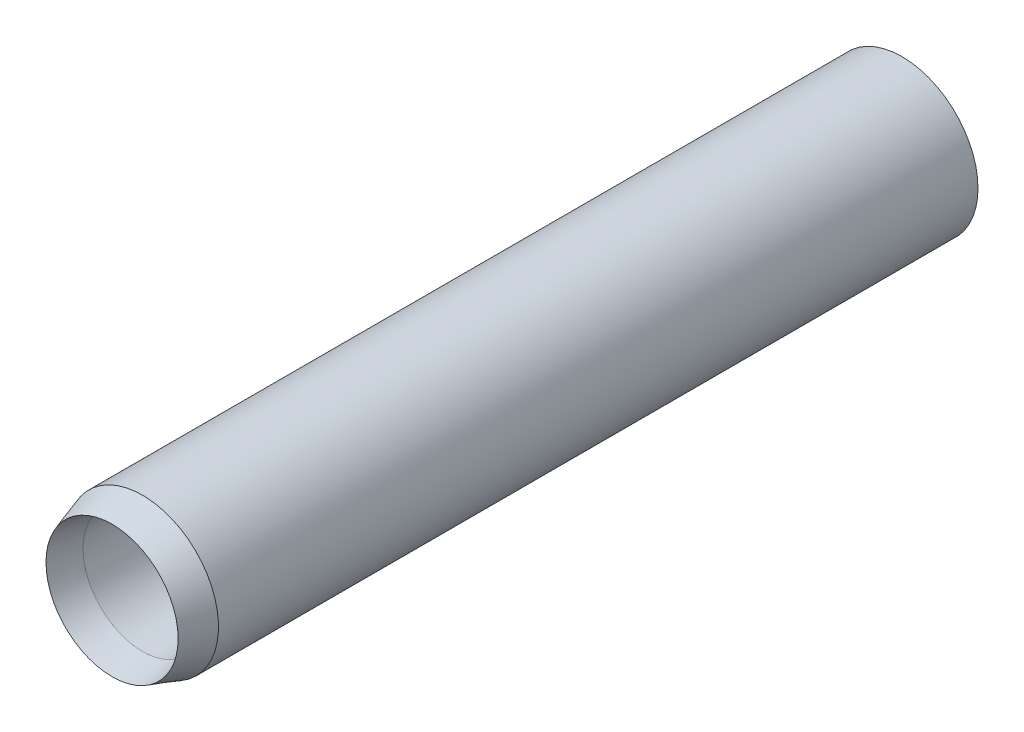
ISO-10303-21;
HEADER;
FILE_DESCRIPTION(('STEP AP214'),'2;1');
FILE_NAME('part.step','',(''),(''),'','','');
FILE_SCHEMA(('AUTOMOTIVE_DESIGN { 1 0 10303 214 1 1 1 1 }'));
ENDSEC;
DATA;
#1=APPLICATION_CONTEXT('core data for automotive mechanical design processes');
#2=APPLICATION_PROTOCOL_DEFINITION('international standard','automotive_design',2000,#1);
#3=PRODUCT_CONTEXT('',#1,'mechanical');
#4=PRODUCT('Part','Part','',(#3));
#5=PRODUCT_RELATED_PRODUCT_CATEGORY('part','',(#4));
#6=PRODUCT_DEFINITION_FORMATION('','',#4);
#7=PRODUCT_DEFINITION_CONTEXT('part definition',#1,'design');
#8=PRODUCT_DEFINITION('design','',#6,#7);
#9=PRODUCT_DEFINITION_SHAPE('','',#8);
#10=(LENGTH_UNIT() NAMED_UNIT(*) SI_UNIT(.MILLI.,.METRE.));
#11=(NAMED_UNIT(*) PLANE_ANGLE_UNIT() SI_UNIT($,.RADIAN.));
#12=(NAMED_UNIT(*) SI_UNIT($,.STERADIAN.) SOLID_ANGLE_UNIT());
#13=UNCERTAINTY_MEASURE_WITH_UNIT(LENGTH_MEASURE(1.E-05),#10,'distance_accuracy_value','');
#14=(GEOMETRIC_REPRESENTATION_CONTEXT(3) GLOBAL_UNCERTAINTY_ASSIGNED_CONTEXT((#13)) GLOBAL_UNIT_ASSIGNED_CONTEXT((#10,
#11,#12)) REPRESENTATION_CONTEXT('',''));
#15=CARTESIAN_POINT('',(0.,0.,0.));
#16=DIRECTION('',(0.,0.,1.));
#17=DIRECTION('',(1.,0.,0.));
#18=AXIS2_PLACEMENT_3D('',#15,#16,#17);
#19=CARTESIAN_POINT('',(5.5,-10.87627944163,11.85));
#20=DIRECTION('',(0.,0.,-1.));
#21=DIRECTION('',(-1.,0.,0.));
#22=AXIS2_PLACEMENT_3D('',#19,#20,#21);
#23=CYLINDRICAL_SURFACE('',#22,0.7834936492);
#24=CARTESIAN_POINT('',(5.5,-10.87627944163,1.85));
#25=DIRECTION('',(0.,0.,1.));
#26=DIRECTION('',(1.,0.,0.));
#27=AXIS2_PLACEMENT_3D('',#24,#25,#26);
#28=CIRCLE('',#27,0.7834936492);
#29=CARTESIAN_POINT('',(6.2834936492,-10.87627944163,1.85));
#30=VERTEX_POINT('',#29);
#31=EDGE_CURVE('E43',#30,#30,#28,.T.);
#32=ORIENTED_EDGE('',*,*,#31,.F.);
#33=EDGE_LOOP('',(#32));
#34=FACE_BOUND('',#33,.T.);
#35=CARTESIAN_POINT('',(5.5,-10.87627944163,11.8499999999966));
#36=DIRECTION('',(0.,0.,-1.));
#37=DIRECTION('',(1.,0.,0.));
#38=AXIS2_PLACEMENT_3D('',#35,#36,#37);
#39=CIRCLE('',#38,0.7834936492);
#40=CARTESIAN_POINT('',(6.2834936492,-10.87627944163,11.8499999999966));
#41=VERTEX_POINT('',#40);
#42=EDGE_CURVE('E10',#41,#41,#39,.T.);
#43=ORIENTED_EDGE('',*,*,#42,.F.);
#44=EDGE_LOOP('',(#43));
#45=FACE_BOUND('',#44,.T.);
#46=ADVANCED_FACE('F14',(#34,#45),#23,.F.);
#47=CARTESIAN_POINT('',(5.5,-10.87627944163,12.05005653991));
#48=DIRECTION('',(0.,0.,1.));
#49=DIRECTION('',(1.,0.,0.));
#50=AXIS2_PLACEMENT_3D('',#47,#48,#49);
#51=CONICAL_SURFACE('',#50,0.8265571952052,0.212021674546486);
#52=CARTESIAN_POINT('',(5.5,-10.87627944163,12.2509258987041));
#53=DIRECTION('',(0.,0.,1.));
#54=DIRECTION('',(1.,0.,0.));
#55=AXIS2_PLACEMENT_3D('',#52,#53,#54);
#56=CIRCLE('',#55,0.869795706064221);
#57=CARTESIAN_POINT('',(6.36979570606422,-10.87627944163,12.2509258987041));
#58=VERTEX_POINT('',#57);
#59=EDGE_CURVE('E21',#58,#58,#56,.T.);
#60=ORIENTED_EDGE('',*,*,#59,.T.);
#61=EDGE_LOOP('',(#60));
#62=FACE_BOUND('',#61,.T.);
#63=ORIENTED_EDGE('',*,*,#42,.T.);
#64=EDGE_LOOP('',(#63));
#65=FACE_BOUND('',#64,.T.);
#66=ADVANCED_FACE('F54',(#62,#65),#51,.F.);
#67=CARTESIAN_POINT('',(5.5,-10.87627944163,12.05003520962));
#68=DIRECTION('',(0.,0.,-1.));
#69=DIRECTION('',(-1.,0.,0.));
#70=AXIS2_PLACEMENT_3D('',#67,#68,#69);
#71=CONICAL_SURFACE('',#70,0.9350367653605,0.314013907387052);
#72=CARTESIAN_POINT('',(5.5,-10.87627944163,11.8500000000046));
#73=DIRECTION('',(0.,0.,1.));
#74=DIRECTION('',(-1.,0.,0.));
#75=AXIS2_PLACEMENT_3D('',#72,#73,#74);
#76=CIRCLE('',#75,1.);
#77=CARTESIAN_POINT('',(4.5,-10.87627944163,11.8500000000046));
#78=VERTEX_POINT('',#77);
#79=EDGE_CURVE('E30',#78,#78,#76,.T.);
#80=ORIENTED_EDGE('',*,*,#79,.T.);
#81=EDGE_LOOP('',(#80));
#82=FACE_BOUND('',#81,.T.);
#83=ORIENTED_EDGE('',*,*,#59,.F.);
#84=EDGE_LOOP('',(#83));
#85=FACE_BOUND('',#84,.T.);
#86=ADVANCED_FACE('F59',(#82,#85),#71,.T.);
#87=CARTESIAN_POINT('',(5.5,-10.87627944163,11.85));
#88=DIRECTION('',(0.,0.,-1.));
#89=DIRECTION('',(-1.,0.,0.));
#90=AXIS2_PLACEMENT_3D('',#87,#88,#89);
#91=CYLINDRICAL_SURFACE('',#90,1.);
#92=CARTESIAN_POINT('',(5.5,-10.87627944163,1.85));
#93=DIRECTION('',(0.,0.,-1.));
#94=DIRECTION('',(1.,0.,0.));
#95=AXIS2_PLACEMENT_3D('',#92,#93,#94);
#96=CIRCLE('',#95,1.);
#97=CARTESIAN_POINT('',(6.5,-10.87627944163,1.85));
#98=VERTEX_POINT('',#97);
#99=EDGE_CURVE('E37',#98,#98,#96,.T.);
#100=ORIENTED_EDGE('',*,*,#99,.F.);
#101=EDGE_LOOP('',(#100));
#102=FACE_BOUND('',#101,.T.);
#103=ORIENTED_EDGE('',*,*,#79,.F.);
#104=EDGE_LOOP('',(#103));
#105=FACE_BOUND('',#104,.T.);
#106=ADVANCED_FACE('F64',(#102,#105),#91,.T.);
#107=CARTESIAN_POINT('',(5.5,-10.87627944163,1.85));
#108=DIRECTION('',(0.,0.,-1.));
#109=DIRECTION('',(0.,-1.,0.));
#110=AXIS2_PLACEMENT_3D('',#107,#108,#109);
#111=PLANE('',#110);
#112=ORIENTED_EDGE('',*,*,#99,.T.);
#113=EDGE_LOOP('',(#112));
#114=FACE_BOUND('',#113,.T.);
#115=ORIENTED_EDGE('',*,*,#31,.T.);
#116=EDGE_LOOP('',(#115));
#117=FACE_BOUND('',#116,.T.);
#118=ADVANCED_FACE('F50',(#114,#117),#111,.T.);
#119=CLOSED_SHELL('',(#46,#66,#86,#106,#118));
#120=MANIFOLD_SOLID_BREP('B1',#119);
#121=ADVANCED_BREP_SHAPE_REPRESENTATION('',(#18,#120),#14);
#122=SHAPE_DEFINITION_REPRESENTATION(#9,#121);
ENDSEC;
END-ISO-10303-21;
